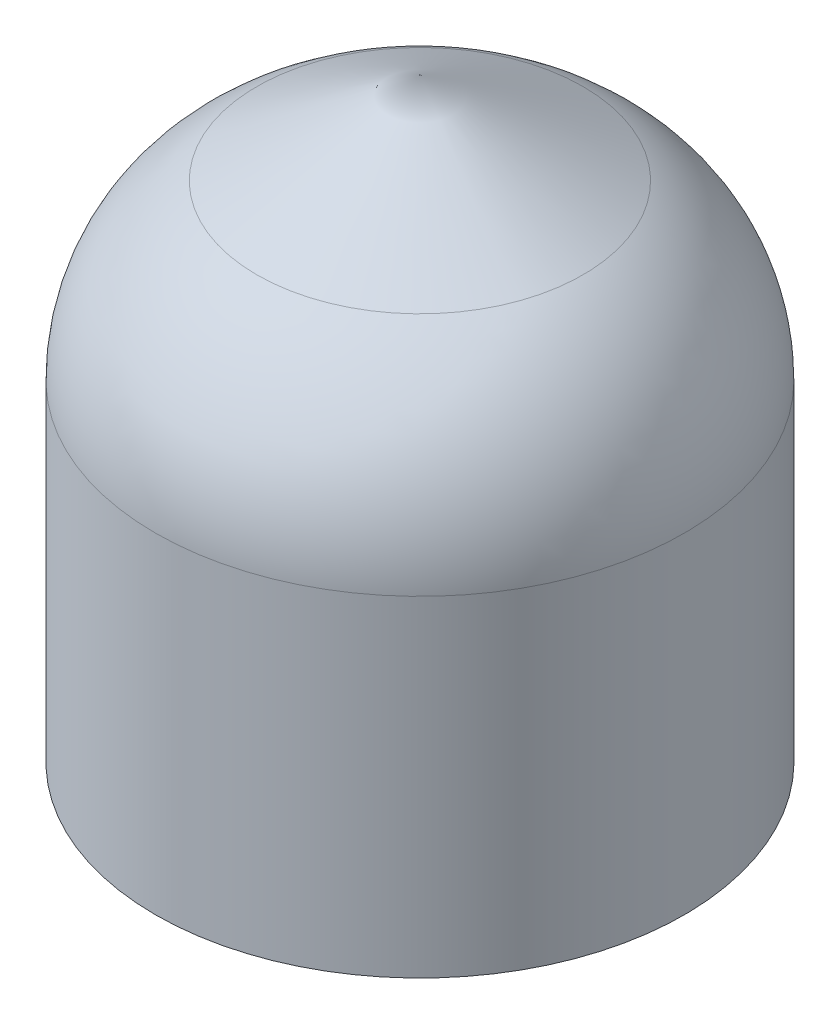
ISO-10303-21;
HEADER;
FILE_DESCRIPTION(('STEP AP214'),'2;1');
FILE_NAME('part.step','',(''),(''),'','','');
FILE_SCHEMA(('AUTOMOTIVE_DESIGN { 1 0 10303 214 1 1 1 1 }'));
ENDSEC;
DATA;
#1=APPLICATION_CONTEXT('core data for automotive mechanical design processes');
#2=APPLICATION_PROTOCOL_DEFINITION('international standard','automotive_design',2000,#1);
#3=PRODUCT_CONTEXT('',#1,'mechanical');
#4=PRODUCT('Part','Part','',(#3));
#5=PRODUCT_RELATED_PRODUCT_CATEGORY('part','',(#4));
#6=PRODUCT_DEFINITION_FORMATION('','',#4);
#7=PRODUCT_DEFINITION_CONTEXT('part definition',#1,'design');
#8=PRODUCT_DEFINITION('design','',#6,#7);
#9=PRODUCT_DEFINITION_SHAPE('','',#8);
#10=(LENGTH_UNIT() NAMED_UNIT(*) SI_UNIT(.MILLI.,.METRE.));
#11=(NAMED_UNIT(*) PLANE_ANGLE_UNIT() SI_UNIT($,.RADIAN.));
#12=(NAMED_UNIT(*) SI_UNIT($,.STERADIAN.) SOLID_ANGLE_UNIT());
#13=UNCERTAINTY_MEASURE_WITH_UNIT(LENGTH_MEASURE(1.E-05),#10,'distance_accuracy_value','');
#14=(GEOMETRIC_REPRESENTATION_CONTEXT(3) GLOBAL_UNCERTAINTY_ASSIGNED_CONTEXT((#13)) GLOBAL_UNIT_ASSIGNED_CONTEXT((#10,
#11,#12)) REPRESENTATION_CONTEXT('',''));
#15=CARTESIAN_POINT('',(0.,0.,0.));
#16=DIRECTION('',(0.,0.,1.));
#17=DIRECTION('',(1.,0.,0.));
#18=AXIS2_PLACEMENT_3D('',#15,#16,#17);
#19=CARTESIAN_POINT('',(0.,5.66176470588235,0.));
#20=DIRECTION('',(0.,1.,0.));
#21=DIRECTION('',(0.,0.,1.));
#22=AXIS2_PLACEMENT_3D('',#19,#20,#21);
#23=CYLINDRICAL_SURFACE('',#22,2.5);
#24=CARTESIAN_POINT('',(0.,7.,0.));
#25=DIRECTION('',(0.,1.,0.));
#26=DIRECTION('',(0.,0.,1.));
#27=AXIS2_PLACEMENT_3D('',#24,#25,#26);
#28=CIRCLE('',#27,2.5);
#29=CARTESIAN_POINT('',(0.,7.,2.5));
#30=VERTEX_POINT('',#29);
#31=EDGE_CURVE('E68',#30,#30,#28,.T.);
#32=ORIENTED_EDGE('',*,*,#31,.T.);
#33=EDGE_LOOP('',(#32));
#34=FACE_BOUND('',#33,.T.);
#35=CARTESIAN_POINT('',(0.,0.,0.));
#36=DIRECTION('',(0.,1.,0.));
#37=DIRECTION('',(0.,0.,1.));
#38=AXIS2_PLACEMENT_3D('',#35,#36,#37);
#39=CIRCLE('',#38,2.5);
#40=CARTESIAN_POINT('',(0.,0.,2.5));
#41=VERTEX_POINT('',#40);
#42=EDGE_CURVE('E11',#41,#41,#39,.T.);
#43=ORIENTED_EDGE('',*,*,#42,.F.);
#44=EDGE_LOOP('',(#43));
#45=FACE_BOUND('',#44,.T.);
#46=ADVANCED_FACE('F33',(#34,#45),#23,.F.);
#47=CARTESIAN_POINT('',(-2.5,0.,0.));
#48=DIRECTION('',(0.,-1.,0.));
#49=DIRECTION('',(0.,0.,-1.));
#50=AXIS2_PLACEMENT_3D('',#47,#48,#49);
#51=PLANE('',#50);
#52=ORIENTED_EDGE('',*,*,#42,.T.);
#53=EDGE_LOOP('',(#52));
#54=FACE_BOUND('',#53,.T.);
#55=CARTESIAN_POINT('',(0.,0.,0.));
#56=DIRECTION('',(0.,1.,0.));
#57=DIRECTION('',(0.,0.,1.));
#58=AXIS2_PLACEMENT_3D('',#55,#56,#57);
#59=CIRCLE('',#58,4.);
#60=CARTESIAN_POINT('',(0.,0.,4.));
#61=VERTEX_POINT('',#60);
#62=EDGE_CURVE('E39',#61,#61,#59,.T.);
#63=ORIENTED_EDGE('',*,*,#62,.F.);
#64=EDGE_LOOP('',(#63));
#65=FACE_BOUND('',#64,.T.);
#66=ADVANCED_FACE('F59',(#54,#65),#51,.T.);
#67=CARTESIAN_POINT('',(0.,5.66176470588235,0.));
#68=DIRECTION('',(0.,1.,0.));
#69=DIRECTION('',(0.,0.,1.));
#70=AXIS2_PLACEMENT_3D('',#67,#68,#69);
#71=CYLINDRICAL_SURFACE('',#70,4.);
#72=ORIENTED_EDGE('',*,*,#62,.T.);
#73=EDGE_LOOP('',(#72));
#74=FACE_BOUND('',#73,.T.);
#75=CARTESIAN_POINT('',(0.,5.,0.));
#76=DIRECTION('',(0.,1.,0.));
#77=DIRECTION('',(0.,0.,1.));
#78=AXIS2_PLACEMENT_3D('',#75,#76,#77);
#79=CIRCLE('',#78,4.);
#80=CARTESIAN_POINT('',(0.,5.,4.));
#81=VERTEX_POINT('',#80);
#82=EDGE_CURVE('E74',#81,#81,#79,.T.);
#83=ORIENTED_EDGE('',*,*,#82,.F.);
#84=EDGE_LOOP('',(#83));
#85=FACE_BOUND('',#84,.T.);
#86=ADVANCED_FACE('F54',(#74,#85),#71,.T.);
#87=CARTESIAN_POINT('',(0.,5.,0.));
#88=DIRECTION('',(0.,1.,0.));
#89=DIRECTION('',(0.,0.,1.));
#90=AXIS2_PLACEMENT_3D('',#87,#88,#89);
#91=DEGENERATE_TOROIDAL_SURFACE('',#90,0.999999999999999,3.,.T.);
#92=ORIENTED_EDGE('',*,*,#82,.T.);
#93=EDGE_LOOP('',(#92));
#94=FACE_BOUND('',#93,.T.);
#95=CARTESIAN_POINT('',(0.,7.61678125730815,0.));
#96=DIRECTION('',(0.,1.,0.));
#97=DIRECTION('',(0.,0.,1.));
#98=AXIS2_PLACEMENT_3D('',#95,#96,#97);
#99=CIRCLE('',#98,2.4671250292326);
#100=CARTESIAN_POINT('',(0.,7.61678125730815,2.4671250292326));
#101=VERTEX_POINT('',#100);
#102=EDGE_CURVE('E76',#101,#101,#99,.T.);
#103=ORIENTED_EDGE('',*,*,#102,.F.);
#104=EDGE_LOOP('',(#103));
#105=FACE_BOUND('',#104,.T.);
#106=ADVANCED_FACE('F45',(#94,#105),#91,.T.);
#107=CARTESIAN_POINT('',(0.,9.,0.));
#108=DIRECTION('',(0.,-1.,0.));
#109=DIRECTION('',(0.,0.,-1.));
#110=AXIS2_PLACEMENT_3D('',#107,#108,#109);
#111=CONICAL_SURFACE('',#110,0.,1.05980557949785);
#112=ORIENTED_EDGE('',*,*,#102,.T.);
#113=EDGE_LOOP('',(#112));
#114=FACE_BOUND('',#113,.T.);
#115=CARTESIAN_POINT('',(0.,9.,0.));
#116=VERTEX_POINT('',#115);
#117=VERTEX_LOOP('',#116);
#118=FACE_BOUND('',#117,.T.);
#119=ADVANCED_FACE('F42',(#114,#118),#111,.T.);
#120=CARTESIAN_POINT('',(0.,7.,0.));
#121=DIRECTION('',(0.,-1.,0.));
#122=DIRECTION('',(0.,0.,-1.));
#123=AXIS2_PLACEMENT_3D('',#120,#121,#122);
#124=PLANE('',#123);
#125=ORIENTED_EDGE('',*,*,#31,.F.);
#126=EDGE_LOOP('',(#125));
#127=FACE_BOUND('',#126,.T.);
#128=ADVANCED_FACE('F44',(#127),#124,.T.);
#129=CLOSED_SHELL('',(#46,#66,#86,#106,#119,#128));
#130=MANIFOLD_SOLID_BREP('B2',#129);
#131=ADVANCED_BREP_SHAPE_REPRESENTATION('',(#18,#130),#14);
#132=SHAPE_DEFINITION_REPRESENTATION(#9,#131);
ENDSEC;
END-ISO-10303-21;
